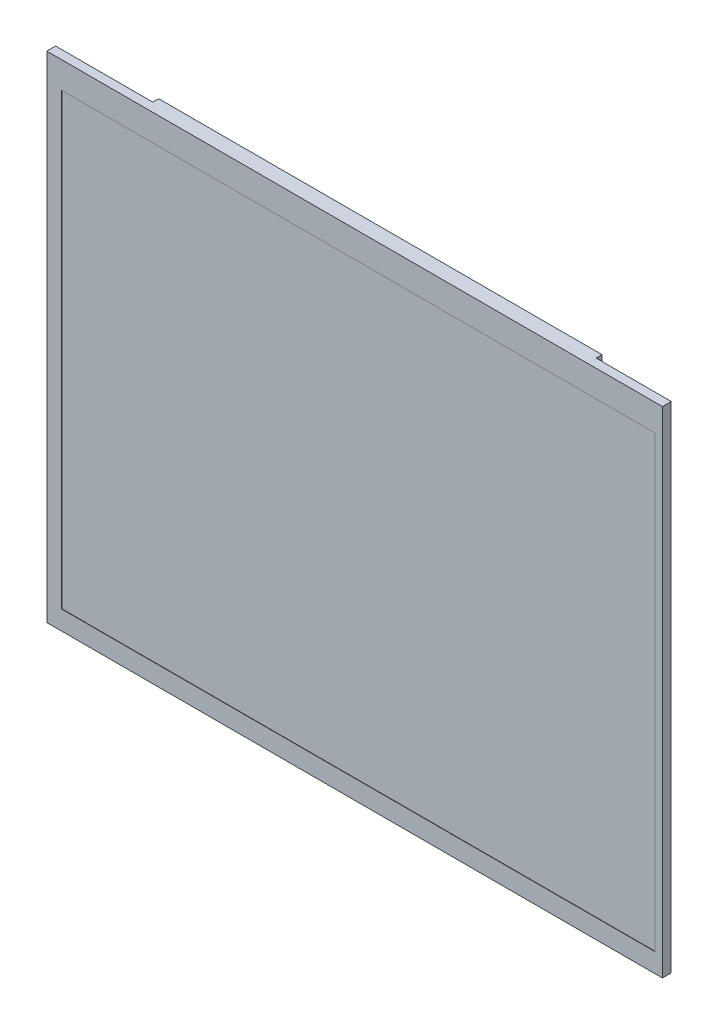
ISO-10303-21;
HEADER;
FILE_DESCRIPTION(('STEP AP214'),'2;1');
FILE_NAME('part.step','',(''),(''),'','','');
FILE_SCHEMA(('AUTOMOTIVE_DESIGN { 1 0 10303 214 1 1 1 1 }'));
ENDSEC;
DATA;
#1=APPLICATION_CONTEXT('core data for automotive mechanical design processes');
#2=APPLICATION_PROTOCOL_DEFINITION('international standard','automotive_design',2000,#1);
#3=PRODUCT_CONTEXT('',#1,'mechanical');
#4=PRODUCT('Part','Part','',(#3));
#5=PRODUCT_RELATED_PRODUCT_CATEGORY('part','',(#4));
#6=PRODUCT_DEFINITION_FORMATION('','',#4);
#7=PRODUCT_DEFINITION_CONTEXT('part definition',#1,'design');
#8=PRODUCT_DEFINITION('design','',#6,#7);
#9=PRODUCT_DEFINITION_SHAPE('','',#8);
#10=(LENGTH_UNIT() NAMED_UNIT(*) SI_UNIT(.MILLI.,.METRE.));
#11=(NAMED_UNIT(*) PLANE_ANGLE_UNIT() SI_UNIT($,.RADIAN.));
#12=(NAMED_UNIT(*) SI_UNIT($,.STERADIAN.) SOLID_ANGLE_UNIT());
#13=UNCERTAINTY_MEASURE_WITH_UNIT(LENGTH_MEASURE(1.E-05),#10,'distance_accuracy_value','');
#14=(GEOMETRIC_REPRESENTATION_CONTEXT(3) GLOBAL_UNCERTAINTY_ASSIGNED_CONTEXT((#13)) GLOBAL_UNIT_ASSIGNED_CONTEXT((#10,
#11,#12)) REPRESENTATION_CONTEXT('',''));
#15=CARTESIAN_POINT('',(0.,0.,0.));
#16=DIRECTION('',(0.,0.,1.));
#17=DIRECTION('',(1.,0.,0.));
#18=AXIS2_PLACEMENT_3D('',#15,#16,#17);
#19=CARTESIAN_POINT('',(0.,0.,3.));
#20=DIRECTION('',(0.,0.,-1.));
#21=DIRECTION('',(-1.,0.,0.));
#22=AXIS2_PLACEMENT_3D('',#19,#20,#21);
#23=PLANE('',#22);
#24=DIRECTION('',(0.,-1.,0.));
#25=VECTOR('',#24,1.);
#26=CARTESIAN_POINT('',(0.,0.,3.));
#27=LINE('',#26,#25);
#28=CARTESIAN_POINT('',(0.,168.,3.));
#29=VERTEX_POINT('',#28);
#30=CARTESIAN_POINT('',(0.,0.,3.));
#31=VERTEX_POINT('',#30);
#32=EDGE_CURVE('E186',#29,#31,#27,.T.);
#33=ORIENTED_EDGE('',*,*,#32,.T.);
#34=DIRECTION('',(1.,0.,0.));
#35=VECTOR('',#34,1.);
#36=CARTESIAN_POINT('',(0.,0.,3.));
#37=LINE('',#36,#35);
#38=CARTESIAN_POINT('',(209.,0.,3.));
#39=VERTEX_POINT('',#38);
#40=EDGE_CURVE('E189',#31,#39,#37,.T.);
#41=ORIENTED_EDGE('',*,*,#40,.T.);
#42=DIRECTION('',(0.,1.,0.));
#43=VECTOR('',#42,1.);
#44=CARTESIAN_POINT('',(209.,0.,3.));
#45=LINE('',#44,#43);
#46=CARTESIAN_POINT('',(209.,168.,3.));
#47=VERTEX_POINT('',#46);
#48=EDGE_CURVE('E192',#39,#47,#45,.T.);
#49=ORIENTED_EDGE('',*,*,#48,.T.);
#50=DIRECTION('',(-1.,0.,0.));
#51=VECTOR('',#50,1.);
#52=CARTESIAN_POINT('',(0.,168.,3.));
#53=LINE('',#52,#51);
#54=EDGE_CURVE('E194',#47,#29,#53,.T.);
#55=ORIENTED_EDGE('',*,*,#54,.T.);
#56=EDGE_LOOP('',(#33,#41,#49,#55));
#57=FACE_BOUND('',#56,.T.);
#58=DIRECTION('',(0.,-1.,0.));
#59=VECTOR('',#58,1.);
#60=CARTESIAN_POINT('',(5.,159.,3.));
#61=LINE('',#60,#59);
#62=CARTESIAN_POINT('',(5.,159.,3.));
#63=VERTEX_POINT('',#62);
#64=CARTESIAN_POINT('',(5.,6.5,3.));
#65=VERTEX_POINT('',#64);
#66=EDGE_CURVE('E165',#63,#65,#61,.T.);
#67=ORIENTED_EDGE('',*,*,#66,.F.);
#68=DIRECTION('',(-1.,0.,0.));
#69=VECTOR('',#68,1.);
#70=CARTESIAN_POINT('',(5.,159.,3.));
#71=LINE('',#70,#69);
#72=CARTESIAN_POINT('',(206.5,159.,3.));
#73=VERTEX_POINT('',#72);
#74=EDGE_CURVE('E172',#73,#63,#71,.T.);
#75=ORIENTED_EDGE('',*,*,#74,.F.);
#76=DIRECTION('',(0.,1.,0.));
#77=VECTOR('',#76,1.);
#78=CARTESIAN_POINT('',(206.5,159.,3.));
#79=LINE('',#78,#77);
#80=CARTESIAN_POINT('',(206.5,6.5,3.));
#81=VERTEX_POINT('',#80);
#82=EDGE_CURVE('E169',#81,#73,#79,.T.);
#83=ORIENTED_EDGE('',*,*,#82,.F.);
#84=DIRECTION('',(1.,0.,0.));
#85=VECTOR('',#84,1.);
#86=CARTESIAN_POINT('',(5.,6.5,3.));
#87=LINE('',#86,#85);
#88=EDGE_CURVE('E167',#65,#81,#87,.T.);
#89=ORIENTED_EDGE('',*,*,#88,.F.);
#90=EDGE_LOOP('',(#67,#75,#83,#89));
#91=FACE_BOUND('',#90,.T.);
#92=ADVANCED_FACE('F39',(#57,#91),#23,.F.);
#93=CARTESIAN_POINT('',(0.,0.,0.));
#94=DIRECTION('',(0.,0.,-1.));
#95=DIRECTION('',(-1.,0.,0.));
#96=AXIS2_PLACEMENT_3D('',#93,#94,#95);
#97=PLANE('',#96);
#98=DIRECTION('',(0.,-1.,0.));
#99=VECTOR('',#98,1.);
#100=CARTESIAN_POINT('',(183.5,168.,0.));
#101=LINE('',#100,#99);
#102=CARTESIAN_POINT('',(183.5,168.,0.));
#103=VERTEX_POINT('',#102);
#104=CARTESIAN_POINT('',(183.5,159.,0.));
#105=VERTEX_POINT('',#104);
#106=EDGE_CURVE('E149',#103,#105,#101,.T.);
#107=ORIENTED_EDGE('',*,*,#106,.F.);
#108=DIRECTION('',(-1.,0.,0.));
#109=VECTOR('',#108,1.);
#110=CARTESIAN_POINT('',(0.,168.,0.));
#111=LINE('',#110,#109);
#112=CARTESIAN_POINT('',(209.,168.,0.));
#113=VERTEX_POINT('',#112);
#114=EDGE_CURVE('E190',#113,#103,#111,.T.);
#115=ORIENTED_EDGE('',*,*,#114,.F.);
#116=DIRECTION('',(0.,1.,0.));
#117=VECTOR('',#116,1.);
#118=CARTESIAN_POINT('',(209.,0.,0.));
#119=LINE('',#118,#117);
#120=CARTESIAN_POINT('',(209.,0.,0.));
#121=VERTEX_POINT('',#120);
#122=EDGE_CURVE('E201',#121,#113,#119,.T.);
#123=ORIENTED_EDGE('',*,*,#122,.F.);
#124=DIRECTION('',(1.,0.,0.));
#125=VECTOR('',#124,1.);
#126=CARTESIAN_POINT('',(0.,0.,0.));
#127=LINE('',#126,#125);
#128=CARTESIAN_POINT('',(0.,0.,0.));
#129=VERTEX_POINT('',#128);
#130=EDGE_CURVE('E199',#129,#121,#127,.T.);
#131=ORIENTED_EDGE('',*,*,#130,.F.);
#132=DIRECTION('',(0.,-1.,0.));
#133=VECTOR('',#132,1.);
#134=CARTESIAN_POINT('',(0.,0.,0.));
#135=LINE('',#134,#133);
#136=CARTESIAN_POINT('',(0.,168.,0.));
#137=VERTEX_POINT('',#136);
#138=EDGE_CURVE('E185',#137,#129,#135,.T.);
#139=ORIENTED_EDGE('',*,*,#138,.F.);
#140=CARTESIAN_POINT('',(33.,168.,0.));
#141=VERTEX_POINT('',#140);
#142=EDGE_CURVE('E60',#141,#137,#111,.T.);
#143=ORIENTED_EDGE('',*,*,#142,.F.);
#144=DIRECTION('',(0.,1.,0.));
#145=VECTOR('',#144,1.);
#146=CARTESIAN_POINT('',(33.,168.,0.));
#147=LINE('',#146,#145);
#148=CARTESIAN_POINT('',(33.,159.,0.));
#149=VERTEX_POINT('',#148);
#150=EDGE_CURVE('E146',#149,#141,#147,.T.);
#151=ORIENTED_EDGE('',*,*,#150,.F.);
#152=DIRECTION('',(-1.,0.,0.));
#153=VECTOR('',#152,1.);
#154=CARTESIAN_POINT('',(183.5,159.,0.));
#155=LINE('',#154,#153);
#156=EDGE_CURVE('E54',#105,#149,#155,.T.);
#157=ORIENTED_EDGE('',*,*,#156,.F.);
#158=EDGE_LOOP('',(#107,#115,#123,#131,#139,#143,#151,#157));
#159=FACE_BOUND('',#158,.T.);
#160=ADVANCED_FACE('F218',(#159),#97,.T.);
#161=CARTESIAN_POINT('',(0.,0.,3.));
#162=DIRECTION('',(1.,0.,0.));
#163=DIRECTION('',(0.,0.,-1.));
#164=AXIS2_PLACEMENT_3D('',#161,#162,#163);
#165=PLANE('',#164);
#166=ORIENTED_EDGE('',*,*,#138,.T.);
#167=DIRECTION('',(0.,0.,-1.));
#168=VECTOR('',#167,1.);
#169=CARTESIAN_POINT('',(0.,0.,3.));
#170=LINE('',#169,#168);
#171=EDGE_CURVE('E11',#31,#129,#170,.T.);
#172=ORIENTED_EDGE('',*,*,#171,.F.);
#173=ORIENTED_EDGE('',*,*,#32,.F.);
#174=DIRECTION('',(0.,0.,-1.));
#175=VECTOR('',#174,1.);
#176=CARTESIAN_POINT('',(0.,168.,3.));
#177=LINE('',#176,#175);
#178=EDGE_CURVE('E196',#29,#137,#177,.T.);
#179=ORIENTED_EDGE('',*,*,#178,.T.);
#180=EDGE_LOOP('',(#166,#172,#173,#179));
#181=FACE_BOUND('',#180,.T.);
#182=ADVANCED_FACE('F41',(#181),#165,.F.);
#183=CARTESIAN_POINT('',(0.,0.,3.));
#184=DIRECTION('',(0.,1.,0.));
#185=DIRECTION('',(0.,0.,1.));
#186=AXIS2_PLACEMENT_3D('',#183,#184,#185);
#187=PLANE('',#186);
#188=ORIENTED_EDGE('',*,*,#130,.T.);
#189=DIRECTION('',(0.,0.,-1.));
#190=VECTOR('',#189,1.);
#191=CARTESIAN_POINT('',(209.,0.,3.));
#192=LINE('',#191,#190);
#193=EDGE_CURVE('E47',#39,#121,#192,.T.);
#194=ORIENTED_EDGE('',*,*,#193,.F.);
#195=ORIENTED_EDGE('',*,*,#40,.F.);
#196=ORIENTED_EDGE('',*,*,#171,.T.);
#197=EDGE_LOOP('',(#188,#194,#195,#196));
#198=FACE_BOUND('',#197,.T.);
#199=ADVANCED_FACE('F239',(#198),#187,.F.);
#200=CARTESIAN_POINT('',(209.,0.,3.));
#201=DIRECTION('',(-1.,0.,0.));
#202=DIRECTION('',(0.,0.,1.));
#203=AXIS2_PLACEMENT_3D('',#200,#201,#202);
#204=PLANE('',#203);
#205=ORIENTED_EDGE('',*,*,#122,.T.);
#206=DIRECTION('',(0.,0.,-1.));
#207=VECTOR('',#206,1.);
#208=CARTESIAN_POINT('',(209.,168.,3.));
#209=LINE('',#208,#207);
#210=EDGE_CURVE('E207',#47,#113,#209,.T.);
#211=ORIENTED_EDGE('',*,*,#210,.F.);
#212=ORIENTED_EDGE('',*,*,#48,.F.);
#213=ORIENTED_EDGE('',*,*,#193,.T.);
#214=EDGE_LOOP('',(#205,#211,#212,#213));
#215=FACE_BOUND('',#214,.T.);
#216=ADVANCED_FACE('F214',(#215),#204,.F.);
#217=CARTESIAN_POINT('',(0.,168.,3.));
#218=DIRECTION('',(0.,-1.,0.));
#219=DIRECTION('',(1.,0.,0.));
#220=AXIS2_PLACEMENT_3D('',#217,#218,#219);
#221=PLANE('',#220);
#222=ORIENTED_EDGE('',*,*,#114,.T.);
#223=DIRECTION('',(0.,0.,1.));
#224=VECTOR('',#223,1.);
#225=CARTESIAN_POINT('',(183.5,168.,-2.));
#226=LINE('',#225,#224);
#227=CARTESIAN_POINT('',(183.5,168.,-2.));
#228=VERTEX_POINT('',#227);
#229=EDGE_CURVE('E221',#228,#103,#226,.T.);
#230=ORIENTED_EDGE('',*,*,#229,.F.);
#231=DIRECTION('',(1.,0.,0.));
#232=VECTOR('',#231,1.);
#233=CARTESIAN_POINT('',(183.5,168.,-2.));
#234=LINE('',#233,#232);
#235=CARTESIAN_POINT('',(33.,168.,-2.));
#236=VERTEX_POINT('',#235);
#237=EDGE_CURVE('E142',#236,#228,#234,.T.);
#238=ORIENTED_EDGE('',*,*,#237,.F.);
#239=DIRECTION('',(0.,0.,1.));
#240=VECTOR('',#239,1.);
#241=CARTESIAN_POINT('',(33.,168.,-2.));
#242=LINE('',#241,#240);
#243=EDGE_CURVE('E154',#236,#141,#242,.T.);
#244=ORIENTED_EDGE('',*,*,#243,.T.);
#245=ORIENTED_EDGE('',*,*,#142,.T.);
#246=ORIENTED_EDGE('',*,*,#178,.F.);
#247=ORIENTED_EDGE('',*,*,#54,.F.);
#248=ORIENTED_EDGE('',*,*,#210,.T.);
#249=EDGE_LOOP('',(#222,#230,#238,#244,#245,#246,#247,#248));
#250=FACE_BOUND('',#249,.T.);
#251=ADVANCED_FACE('F220',(#250),#221,.F.);
#252=CARTESIAN_POINT('',(5.,159.,3.));
#253=DIRECTION('',(1.,0.,0.));
#254=DIRECTION('',(0.,0.,-1.));
#255=AXIS2_PLACEMENT_3D('',#252,#253,#254);
#256=PLANE('',#255);
#257=DIRECTION('',(0.,-1.,0.));
#258=VECTOR('',#257,1.);
#259=CARTESIAN_POINT('',(5.,0.,2.9));
#260=LINE('',#259,#258);
#261=CARTESIAN_POINT('',(5.,159.,2.9));
#262=VERTEX_POINT('',#261);
#263=CARTESIAN_POINT('',(5.,6.5,2.9));
#264=VERTEX_POINT('',#263);
#265=EDGE_CURVE('E159',#262,#264,#260,.T.);
#266=ORIENTED_EDGE('',*,*,#265,.F.);
#267=DIRECTION('',(0.,0.,-1.));
#268=VECTOR('',#267,1.);
#269=CARTESIAN_POINT('',(5.,159.,3.));
#270=LINE('',#269,#268);
#271=EDGE_CURVE('E174',#63,#262,#270,.T.);
#272=ORIENTED_EDGE('',*,*,#271,.F.);
#273=ORIENTED_EDGE('',*,*,#66,.T.);
#274=DIRECTION('',(0.,0.,-1.));
#275=VECTOR('',#274,1.);
#276=CARTESIAN_POINT('',(5.,6.5,3.));
#277=LINE('',#276,#275);
#278=EDGE_CURVE('E182',#65,#264,#277,.T.);
#279=ORIENTED_EDGE('',*,*,#278,.T.);
#280=EDGE_LOOP('',(#266,#272,#273,#279));
#281=FACE_BOUND('',#280,.T.);
#282=ADVANCED_FACE('F253',(#281),#256,.T.);
#283=CARTESIAN_POINT('',(5.,6.5,3.));
#284=DIRECTION('',(0.,1.,0.));
#285=DIRECTION('',(0.,0.,1.));
#286=AXIS2_PLACEMENT_3D('',#283,#284,#285);
#287=PLANE('',#286);
#288=DIRECTION('',(1.,0.,0.));
#289=VECTOR('',#288,1.);
#290=CARTESIAN_POINT('',(0.,6.5,2.9));
#291=LINE('',#290,#289);
#292=CARTESIAN_POINT('',(206.5,6.5,2.9));
#293=VERTEX_POINT('',#292);
#294=EDGE_CURVE('E162',#264,#293,#291,.T.);
#295=ORIENTED_EDGE('',*,*,#294,.F.);
#296=ORIENTED_EDGE('',*,*,#278,.F.);
#297=ORIENTED_EDGE('',*,*,#88,.T.);
#298=DIRECTION('',(0.,0.,-1.));
#299=VECTOR('',#298,1.);
#300=CARTESIAN_POINT('',(206.5,6.5,3.));
#301=LINE('',#300,#299);
#302=EDGE_CURVE('E179',#81,#293,#301,.T.);
#303=ORIENTED_EDGE('',*,*,#302,.T.);
#304=EDGE_LOOP('',(#295,#296,#297,#303));
#305=FACE_BOUND('',#304,.T.);
#306=ADVANCED_FACE('F260',(#305),#287,.T.);
#307=CARTESIAN_POINT('',(206.5,159.,3.));
#308=DIRECTION('',(-1.,0.,0.));
#309=DIRECTION('',(0.,0.,1.));
#310=AXIS2_PLACEMENT_3D('',#307,#308,#309);
#311=PLANE('',#310);
#312=DIRECTION('',(0.,-1.,0.));
#313=VECTOR('',#312,1.);
#314=CARTESIAN_POINT('',(206.5,0.,2.9));
#315=LINE('',#314,#313);
#316=CARTESIAN_POINT('',(206.5,159.,2.9));
#317=VERTEX_POINT('',#316);
#318=EDGE_CURVE('E150',#317,#293,#315,.T.);
#319=ORIENTED_EDGE('',*,*,#318,.T.);
#320=ORIENTED_EDGE('',*,*,#302,.F.);
#321=ORIENTED_EDGE('',*,*,#82,.T.);
#322=DIRECTION('',(0.,0.,-1.));
#323=VECTOR('',#322,1.);
#324=CARTESIAN_POINT('',(206.5,159.,3.));
#325=LINE('',#324,#323);
#326=EDGE_CURVE('E176',#73,#317,#325,.T.);
#327=ORIENTED_EDGE('',*,*,#326,.T.);
#328=EDGE_LOOP('',(#319,#320,#321,#327));
#329=FACE_BOUND('',#328,.T.);
#330=ADVANCED_FACE('F265',(#329),#311,.T.);
#331=CARTESIAN_POINT('',(5.,159.,3.));
#332=DIRECTION('',(0.,-1.,0.));
#333=DIRECTION('',(0.,0.,-1.));
#334=AXIS2_PLACEMENT_3D('',#331,#332,#333);
#335=PLANE('',#334);
#336=DIRECTION('',(1.,0.,0.));
#337=VECTOR('',#336,1.);
#338=CARTESIAN_POINT('',(0.,159.,2.9));
#339=LINE('',#338,#337);
#340=EDGE_CURVE('E152',#262,#317,#339,.T.);
#341=ORIENTED_EDGE('',*,*,#340,.T.);
#342=ORIENTED_EDGE('',*,*,#326,.F.);
#343=ORIENTED_EDGE('',*,*,#74,.T.);
#344=ORIENTED_EDGE('',*,*,#271,.T.);
#345=EDGE_LOOP('',(#341,#342,#343,#344));
#346=FACE_BOUND('',#345,.T.);
#347=ADVANCED_FACE('F276',(#346),#335,.T.);
#348=CARTESIAN_POINT('',(0.,0.,2.9));
#349=DIRECTION('',(0.,0.,1.));
#350=DIRECTION('',(1.,0.,0.));
#351=AXIS2_PLACEMENT_3D('',#348,#349,#350);
#352=PLANE('',#351);
#353=ORIENTED_EDGE('',*,*,#318,.F.);
#354=ORIENTED_EDGE('',*,*,#340,.F.);
#355=ORIENTED_EDGE('',*,*,#265,.T.);
#356=ORIENTED_EDGE('',*,*,#294,.T.);
#357=EDGE_LOOP('',(#353,#354,#355,#356));
#358=FACE_BOUND('',#357,.T.);
#359=ADVANCED_FACE('F274',(#358),#352,.T.);
#360=CARTESIAN_POINT('',(183.5,168.,-2.));
#361=DIRECTION('',(-1.,0.,0.));
#362=DIRECTION('',(0.,0.,1.));
#363=AXIS2_PLACEMENT_3D('',#360,#361,#362);
#364=PLANE('',#363);
#365=ORIENTED_EDGE('',*,*,#106,.T.);
#366=DIRECTION('',(0.,0.,1.));
#367=VECTOR('',#366,1.);
#368=CARTESIAN_POINT('',(183.5,159.,-2.));
#369=LINE('',#368,#367);
#370=CARTESIAN_POINT('',(183.5,159.,-2.));
#371=VERTEX_POINT('',#370);
#372=EDGE_CURVE('E130',#371,#105,#369,.T.);
#373=ORIENTED_EDGE('',*,*,#372,.F.);
#374=DIRECTION('',(0.,-1.,0.));
#375=VECTOR('',#374,1.);
#376=CARTESIAN_POINT('',(183.5,168.,-2.));
#377=LINE('',#376,#375);
#378=EDGE_CURVE('E137',#228,#371,#377,.T.);
#379=ORIENTED_EDGE('',*,*,#378,.F.);
#380=ORIENTED_EDGE('',*,*,#229,.T.);
#381=EDGE_LOOP('',(#365,#373,#379,#380));
#382=FACE_BOUND('',#381,.T.);
#383=ADVANCED_FACE('F148',(#382),#364,.F.);
#384=CARTESIAN_POINT('',(183.5,159.,-2.));
#385=DIRECTION('',(0.,1.,0.));
#386=DIRECTION('',(0.,0.,1.));
#387=AXIS2_PLACEMENT_3D('',#384,#385,#386);
#388=PLANE('',#387);
#389=ORIENTED_EDGE('',*,*,#156,.T.);
#390=DIRECTION('',(0.,0.,1.));
#391=VECTOR('',#390,1.);
#392=CARTESIAN_POINT('',(33.,159.,-2.));
#393=LINE('',#392,#391);
#394=CARTESIAN_POINT('',(33.,159.,-2.));
#395=VERTEX_POINT('',#394);
#396=EDGE_CURVE('E133',#395,#149,#393,.T.);
#397=ORIENTED_EDGE('',*,*,#396,.F.);
#398=DIRECTION('',(-1.,0.,0.));
#399=VECTOR('',#398,1.);
#400=CARTESIAN_POINT('',(183.5,159.,-2.));
#401=LINE('',#400,#399);
#402=EDGE_CURVE('E126',#371,#395,#401,.T.);
#403=ORIENTED_EDGE('',*,*,#402,.F.);
#404=ORIENTED_EDGE('',*,*,#372,.T.);
#405=EDGE_LOOP('',(#389,#397,#403,#404));
#406=FACE_BOUND('',#405,.T.);
#407=ADVANCED_FACE('F128',(#406),#388,.F.);
#408=CARTESIAN_POINT('',(33.,168.,-2.));
#409=DIRECTION('',(1.,0.,0.));
#410=DIRECTION('',(0.,0.,-1.));
#411=AXIS2_PLACEMENT_3D('',#408,#409,#410);
#412=PLANE('',#411);
#413=ORIENTED_EDGE('',*,*,#150,.T.);
#414=ORIENTED_EDGE('',*,*,#243,.F.);
#415=DIRECTION('',(0.,1.,0.));
#416=VECTOR('',#415,1.);
#417=CARTESIAN_POINT('',(33.,168.,-2.));
#418=LINE('',#417,#416);
#419=EDGE_CURVE('E136',#395,#236,#418,.T.);
#420=ORIENTED_EDGE('',*,*,#419,.F.);
#421=ORIENTED_EDGE('',*,*,#396,.T.);
#422=EDGE_LOOP('',(#413,#414,#420,#421));
#423=FACE_BOUND('',#422,.T.);
#424=ADVANCED_FACE('F232',(#423),#412,.F.);
#425=CARTESIAN_POINT('',(0.,0.,-2.));
#426=DIRECTION('',(0.,0.,-1.));
#427=DIRECTION('',(-1.,0.,0.));
#428=AXIS2_PLACEMENT_3D('',#425,#426,#427);
#429=PLANE('',#428);
#430=ORIENTED_EDGE('',*,*,#378,.T.);
#431=ORIENTED_EDGE('',*,*,#402,.T.);
#432=ORIENTED_EDGE('',*,*,#419,.T.);
#433=ORIENTED_EDGE('',*,*,#237,.T.);
#434=EDGE_LOOP('',(#430,#431,#432,#433));
#435=FACE_BOUND('',#434,.T.);
#436=ADVANCED_FACE('F140',(#435),#429,.T.);
#437=CLOSED_SHELL('',(#92,#160,#182,#199,#216,#251,#282,#306,#330,#347,#359,#383,#407,#424,#436));
#438=MANIFOLD_SOLID_BREP('B2',#437);
#439=ADVANCED_BREP_SHAPE_REPRESENTATION('',(#18,#438),#14);
#440=SHAPE_DEFINITION_REPRESENTATION(#9,#439);
ENDSEC;
END-ISO-10303-21;
